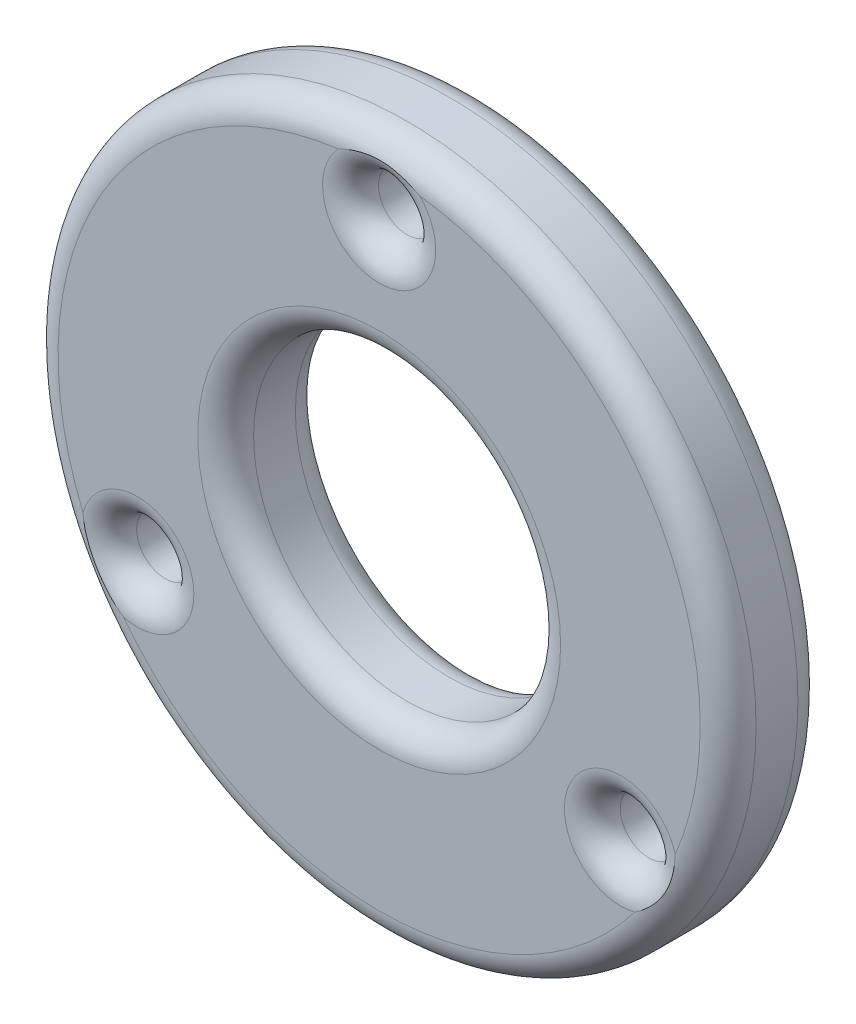
ISO-10303-21;
HEADER;
FILE_DESCRIPTION(('STEP AP214'),'2;1');
FILE_NAME('part.step','',(''),(''),'','','');
FILE_SCHEMA(('AUTOMOTIVE_DESIGN { 1 0 10303 214 1 1 1 1 }'));
ENDSEC;
DATA;
#1=APPLICATION_CONTEXT('core data for automotive mechanical design processes');
#2=APPLICATION_PROTOCOL_DEFINITION('international standard','automotive_design',2000,#1);
#3=PRODUCT_CONTEXT('',#1,'mechanical');
#4=PRODUCT('Part','Part','',(#3));
#5=PRODUCT_RELATED_PRODUCT_CATEGORY('part','',(#4));
#6=PRODUCT_DEFINITION_FORMATION('','',#4);
#7=PRODUCT_DEFINITION_CONTEXT('part definition',#1,'design');
#8=PRODUCT_DEFINITION('design','',#6,#7);
#9=PRODUCT_DEFINITION_SHAPE('','',#8);
#10=(LENGTH_UNIT() NAMED_UNIT(*) SI_UNIT(.MILLI.,.METRE.));
#11=(NAMED_UNIT(*) PLANE_ANGLE_UNIT() SI_UNIT($,.RADIAN.));
#12=(NAMED_UNIT(*) SI_UNIT($,.STERADIAN.) SOLID_ANGLE_UNIT());
#13=UNCERTAINTY_MEASURE_WITH_UNIT(LENGTH_MEASURE(1.E-05),#10,'distance_accuracy_value','');
#14=(GEOMETRIC_REPRESENTATION_CONTEXT(3) GLOBAL_UNCERTAINTY_ASSIGNED_CONTEXT((#13)) GLOBAL_UNIT_ASSIGNED_CONTEXT((#10,
#11,#12)) REPRESENTATION_CONTEXT('',''));
#15=CARTESIAN_POINT('',(0.,0.,0.));
#16=DIRECTION('',(0.,0.,1.));
#17=DIRECTION('',(1.,0.,0.));
#18=AXIS2_PLACEMENT_3D('',#15,#16,#17);
#19=CARTESIAN_POINT('',(0.,110.,3.5));
#20=DIRECTION('',(0.,0.,-1.));
#21=DIRECTION('',(-1.,0.,0.));
#22=AXIS2_PLACEMENT_3D('',#19,#20,#21);
#23=CYLINDRICAL_SURFACE('',#22,2.05);
#24=CARTESIAN_POINT('',(0.,110.,1.5));
#25=DIRECTION('',(0.,0.,1.));
#26=DIRECTION('',(1.,0.,0.));
#27=AXIS2_PLACEMENT_3D('',#24,#25,#26);
#28=CIRCLE('',#27,2.05);
#29=CARTESIAN_POINT('',(2.05,110.,1.5));
#30=VERTEX_POINT('',#29);
#31=EDGE_CURVE('E154',#30,#30,#28,.T.);
#32=ORIENTED_EDGE('',*,*,#31,.T.);
#33=EDGE_LOOP('',(#32));
#34=FACE_BOUND('',#33,.T.);
#35=CARTESIAN_POINT('',(0.,110.,-1.5));
#36=DIRECTION('',(0.,0.,1.));
#37=DIRECTION('',(1.,0.,0.));
#38=AXIS2_PLACEMENT_3D('',#35,#36,#37);
#39=CIRCLE('',#38,2.05);
#40=CARTESIAN_POINT('',(2.05,110.,-1.5));
#41=VERTEX_POINT('',#40);
#42=EDGE_CURVE('E151',#41,#41,#39,.F.);
#43=ORIENTED_EDGE('',*,*,#42,.T.);
#44=EDGE_LOOP('',(#43));
#45=FACE_BOUND('',#44,.T.);
#46=ADVANCED_FACE('F39',(#34,#45),#23,.F.);
#47=CARTESIAN_POINT('',(17.3205080756888,80.,3.5));
#48=DIRECTION('',(0.,0.,-1.));
#49=DIRECTION('',(-1.,0.,0.));
#50=AXIS2_PLACEMENT_3D('',#47,#48,#49);
#51=CYLINDRICAL_SURFACE('',#50,2.04999999999999);
#52=CARTESIAN_POINT('',(17.3205080756888,80.,1.5));
#53=DIRECTION('',(0.,0.,1.));
#54=DIRECTION('',(1.,0.,0.));
#55=AXIS2_PLACEMENT_3D('',#52,#53,#54);
#56=CIRCLE('',#55,2.04999999999999);
#57=CARTESIAN_POINT('',(19.3705080756888,80.,1.5));
#58=VERTEX_POINT('',#57);
#59=EDGE_CURVE('E160',#58,#58,#56,.T.);
#60=ORIENTED_EDGE('',*,*,#59,.T.);
#61=EDGE_LOOP('',(#60));
#62=FACE_BOUND('',#61,.T.);
#63=CARTESIAN_POINT('',(17.3205080756888,80.,-1.5));
#64=DIRECTION('',(0.,0.,1.));
#65=DIRECTION('',(1.,0.,0.));
#66=AXIS2_PLACEMENT_3D('',#63,#64,#65);
#67=CIRCLE('',#66,2.04999999999999);
#68=CARTESIAN_POINT('',(19.3705080756888,80.,-1.5));
#69=VERTEX_POINT('',#68);
#70=EDGE_CURVE('E157',#69,#69,#67,.F.);
#71=ORIENTED_EDGE('',*,*,#70,.T.);
#72=EDGE_LOOP('',(#71));
#73=FACE_BOUND('',#72,.T.);
#74=ADVANCED_FACE('F270',(#62,#73),#51,.F.);
#75=CARTESIAN_POINT('',(-17.3205080756888,80.,3.5));
#76=DIRECTION('',(0.,0.,-1.));
#77=DIRECTION('',(-1.,0.,0.));
#78=AXIS2_PLACEMENT_3D('',#75,#76,#77);
#79=CYLINDRICAL_SURFACE('',#78,2.04999999999998);
#80=CARTESIAN_POINT('',(-17.3205080756888,80.,1.5));
#81=DIRECTION('',(0.,0.,1.));
#82=DIRECTION('',(1.,0.,0.));
#83=AXIS2_PLACEMENT_3D('',#80,#81,#82);
#84=CIRCLE('',#83,2.04999999999998);
#85=CARTESIAN_POINT('',(-15.2705080756888,80.,1.5));
#86=VERTEX_POINT('',#85);
#87=EDGE_CURVE('E166',#86,#86,#84,.T.);
#88=ORIENTED_EDGE('',*,*,#87,.T.);
#89=EDGE_LOOP('',(#88));
#90=FACE_BOUND('',#89,.T.);
#91=CARTESIAN_POINT('',(-17.3205080756888,80.,-1.5));
#92=DIRECTION('',(0.,0.,1.));
#93=DIRECTION('',(1.,0.,0.));
#94=AXIS2_PLACEMENT_3D('',#91,#92,#93);
#95=CIRCLE('',#94,2.04999999999998);
#96=CARTESIAN_POINT('',(-15.2705080756888,80.,-1.5));
#97=VERTEX_POINT('',#96);
#98=EDGE_CURVE('E163',#97,#97,#95,.F.);
#99=ORIENTED_EDGE('',*,*,#98,.T.);
#100=EDGE_LOOP('',(#99));
#101=FACE_BOUND('',#100,.T.);
#102=ADVANCED_FACE('F276',(#90,#101),#79,.F.);
#103=CARTESIAN_POINT('',(0.,90.,3.5));
#104=DIRECTION('',(0.,0.,-1.));
#105=DIRECTION('',(-1.,0.,0.));
#106=AXIS2_PLACEMENT_3D('',#103,#104,#105);
#107=CYLINDRICAL_SURFACE('',#106,11.);
#108=CARTESIAN_POINT('',(0.,90.,1.5));
#109=DIRECTION('',(0.,0.,1.));
#110=DIRECTION('',(1.,0.,0.));
#111=AXIS2_PLACEMENT_3D('',#108,#109,#110);
#112=CIRCLE('',#111,11.);
#113=CARTESIAN_POINT('',(11.,90.,1.5));
#114=VERTEX_POINT('',#113);
#115=EDGE_CURVE('E172',#114,#114,#112,.T.);
#116=ORIENTED_EDGE('',*,*,#115,.T.);
#117=EDGE_LOOP('',(#116));
#118=FACE_BOUND('',#117,.T.);
#119=CARTESIAN_POINT('',(0.,90.,-1.5));
#120=DIRECTION('',(0.,0.,1.));
#121=DIRECTION('',(1.,0.,0.));
#122=AXIS2_PLACEMENT_3D('',#119,#120,#121);
#123=CIRCLE('',#122,11.);
#124=CARTESIAN_POINT('',(11.,90.,-1.5));
#125=VERTEX_POINT('',#124);
#126=EDGE_CURVE('E169',#125,#125,#123,.F.);
#127=ORIENTED_EDGE('',*,*,#126,.T.);
#128=EDGE_LOOP('',(#127));
#129=FACE_BOUND('',#128,.T.);
#130=ADVANCED_FACE('F285',(#118,#129),#107,.F.);
#131=CARTESIAN_POINT('',(0.,90.,3.5));
#132=DIRECTION('',(0.,0.,-1.));
#133=DIRECTION('',(-1.,0.,0.));
#134=AXIS2_PLACEMENT_3D('',#131,#132,#133);
#135=CYLINDRICAL_SURFACE('',#134,25.);
#136=CARTESIAN_POINT('',(0.,90.,1.5));
#137=DIRECTION('',(0.,0.,1.));
#138=DIRECTION('',(1.,0.,0.));
#139=AXIS2_PLACEMENT_3D('',#136,#137,#138);
#140=CIRCLE('',#139,25.);
#141=CARTESIAN_POINT('',(25.,90.,1.5));
#142=VERTEX_POINT('',#141);
#143=EDGE_CURVE('E148',#142,#142,#140,.F.);
#144=ORIENTED_EDGE('',*,*,#143,.T.);
#145=EDGE_LOOP('',(#144));
#146=FACE_BOUND('',#145,.T.);
#147=CARTESIAN_POINT('',(0.,90.,-1.5));
#148=DIRECTION('',(0.,0.,1.));
#149=DIRECTION('',(1.,0.,0.));
#150=AXIS2_PLACEMENT_3D('',#147,#148,#149);
#151=CIRCLE('',#150,25.);
#152=CARTESIAN_POINT('',(25.,90.,-1.5));
#153=VERTEX_POINT('',#152);
#154=EDGE_CURVE('E145',#153,#153,#151,.T.);
#155=ORIENTED_EDGE('',*,*,#154,.T.);
#156=EDGE_LOOP('',(#155));
#157=FACE_BOUND('',#156,.T.);
#158=ADVANCED_FACE('F281',(#146,#157),#135,.T.);
#159=CARTESIAN_POINT('',(0.,0.,3.5));
#160=DIRECTION('',(0.,0.,1.));
#161=DIRECTION('',(1.,0.,0.));
#162=AXIS2_PLACEMENT_3D('',#159,#160,#161);
#163=PLANE('',#162);
#164=CARTESIAN_POINT('',(17.3205080756888,80.,3.5));
#165=DIRECTION('',(0.,0.,1.));
#166=DIRECTION('',(1.,0.,0.));
#167=AXIS2_PLACEMENT_3D('',#164,#165,#166);
#168=CIRCLE('',#167,4.04999999999999);
#169=CARTESIAN_POINT('',(18.3024113712712,76.0708313960681,3.5));
#170=VERTEX_POINT('',#169);
#171=CARTESIAN_POINT('',(21.2142195502373,81.1142311039319,3.5));
#172=VERTEX_POINT('',#171);
#173=EDGE_CURVE('E135',#170,#172,#168,.F.);
#174=ORIENTED_EDGE('',*,*,#173,.T.);
#175=CARTESIAN_POINT('',(0.,90.,3.5));
#176=DIRECTION('',(0.,0.,1.));
#177=DIRECTION('',(1.,0.,0.));
#178=AXIS2_PLACEMENT_3D('',#175,#176,#177);
#179=CIRCLE('',#178,23.);
#180=CARTESIAN_POINT('',(23.,90.,3.5));
#181=VERTEX_POINT('',#180);
#182=EDGE_CURVE('E143',#172,#181,#179,.T.);
#183=ORIENTED_EDGE('',*,*,#182,.T.);
#184=CARTESIAN_POINT('',(0.,90.,3.5));
#185=DIRECTION('',(0.,0.,1.));
#186=DIRECTION('',(1.,0.,0.));
#187=AXIS2_PLACEMENT_3D('',#184,#185,#186);
#188=CIRCLE('',#187,23.);
#189=CARTESIAN_POINT('',(2.91180817896607,112.8149375,3.5));
#190=VERTEX_POINT('',#189);
#191=EDGE_CURVE('E141',#181,#190,#188,.T.);
#192=ORIENTED_EDGE('',*,*,#191,.T.);
#193=CARTESIAN_POINT('',(0.,110.,3.5));
#194=DIRECTION('',(0.,0.,1.));
#195=DIRECTION('',(1.,0.,0.));
#196=AXIS2_PLACEMENT_3D('',#193,#194,#195);
#197=CIRCLE('',#196,4.05);
#198=CARTESIAN_POINT('',(4.05,110.,3.5));
#199=VERTEX_POINT('',#198);
#200=EDGE_CURVE('E139',#190,#199,#197,.F.);
#201=ORIENTED_EDGE('',*,*,#200,.T.);
#202=CARTESIAN_POINT('',(0.,110.,3.5));
#203=DIRECTION('',(0.,0.,1.));
#204=DIRECTION('',(1.,0.,0.));
#205=AXIS2_PLACEMENT_3D('',#202,#203,#204);
#206=CIRCLE('',#205,4.05);
#207=CARTESIAN_POINT('',(-2.91180817896607,112.8149375,3.5));
#208=VERTEX_POINT('',#207);
#209=EDGE_CURVE('E137',#199,#208,#206,.F.);
#210=ORIENTED_EDGE('',*,*,#209,.T.);
#211=CARTESIAN_POINT('',(0.,90.,3.5));
#212=DIRECTION('',(0.,0.,1.));
#213=DIRECTION('',(1.,0.,0.));
#214=AXIS2_PLACEMENT_3D('',#211,#212,#213);
#215=CIRCLE('',#214,23.);
#216=CARTESIAN_POINT('',(-21.2142195502372,81.1142311039319,3.5));
#217=VERTEX_POINT('',#216);
#218=EDGE_CURVE('E120',#208,#217,#215,.T.);
#219=ORIENTED_EDGE('',*,*,#218,.T.);
#220=CARTESIAN_POINT('',(-17.3205080756888,80.,3.5));
#221=DIRECTION('',(0.,0.,1.));
#222=DIRECTION('',(1.,0.,0.));
#223=AXIS2_PLACEMENT_3D('',#220,#221,#222);
#224=CIRCLE('',#223,4.04999999999998);
#225=CARTESIAN_POINT('',(-13.2705080756888,80.,3.5));
#226=VERTEX_POINT('',#225);
#227=EDGE_CURVE('E112',#217,#226,#224,.F.);
#228=ORIENTED_EDGE('',*,*,#227,.T.);
#229=CARTESIAN_POINT('',(-17.3205080756888,80.,3.5));
#230=DIRECTION('',(0.,0.,1.));
#231=DIRECTION('',(1.,0.,0.));
#232=AXIS2_PLACEMENT_3D('',#229,#230,#231);
#233=CIRCLE('',#232,4.04999999999998);
#234=CARTESIAN_POINT('',(-18.3024113712712,76.0708313960681,3.5));
#235=VERTEX_POINT('',#234);
#236=EDGE_CURVE('E117',#226,#235,#233,.F.);
#237=ORIENTED_EDGE('',*,*,#236,.T.);
#238=CARTESIAN_POINT('',(0.,90.,3.5));
#239=DIRECTION('',(0.,0.,1.));
#240=DIRECTION('',(1.,0.,0.));
#241=AXIS2_PLACEMENT_3D('',#238,#239,#240);
#242=CIRCLE('',#241,23.);
#243=EDGE_CURVE('E133',#235,#170,#242,.T.);
#244=ORIENTED_EDGE('',*,*,#243,.T.);
#245=EDGE_LOOP('',(#174,#183,#192,#201,#210,#219,#228,#237,#244));
#246=FACE_BOUND('',#245,.T.);
#247=CARTESIAN_POINT('',(0.,90.,3.5));
#248=DIRECTION('',(0.,0.,1.));
#249=DIRECTION('',(1.,0.,0.));
#250=AXIS2_PLACEMENT_3D('',#247,#248,#249);
#251=CIRCLE('',#250,13.);
#252=CARTESIAN_POINT('',(13.,90.,3.5));
#253=VERTEX_POINT('',#252);
#254=EDGE_CURVE('E127',#253,#253,#251,.F.);
#255=ORIENTED_EDGE('',*,*,#254,.T.);
#256=EDGE_LOOP('',(#255));
#257=FACE_BOUND('',#256,.T.);
#258=ADVANCED_FACE('F114',(#246,#257),#163,.T.);
#259=CARTESIAN_POINT('',(0.,0.,-3.5));
#260=DIRECTION('',(0.,0.,1.));
#261=DIRECTION('',(1.,0.,0.));
#262=AXIS2_PLACEMENT_3D('',#259,#260,#261);
#263=PLANE('',#262);
#264=CARTESIAN_POINT('',(0.,110.,-3.5));
#265=DIRECTION('',(0.,0.,1.));
#266=DIRECTION('',(1.,0.,0.));
#267=AXIS2_PLACEMENT_3D('',#264,#265,#266);
#268=CIRCLE('',#267,4.05);
#269=CARTESIAN_POINT('',(-2.91180817896607,112.8149375,-3.5));
#270=VERTEX_POINT('',#269);
#271=CARTESIAN_POINT('',(4.05,110.,-3.5));
#272=VERTEX_POINT('',#271);
#273=EDGE_CURVE('E189',#270,#272,#268,.T.);
#274=ORIENTED_EDGE('',*,*,#273,.T.);
#275=CARTESIAN_POINT('',(0.,110.,-3.5));
#276=DIRECTION('',(0.,0.,1.));
#277=DIRECTION('',(1.,0.,0.));
#278=AXIS2_PLACEMENT_3D('',#275,#276,#277);
#279=CIRCLE('',#278,4.05);
#280=CARTESIAN_POINT('',(2.91180817896607,112.8149375,-3.5));
#281=VERTEX_POINT('',#280);
#282=EDGE_CURVE('E11',#272,#281,#279,.T.);
#283=ORIENTED_EDGE('',*,*,#282,.T.);
#284=CARTESIAN_POINT('',(0.,90.,-3.5));
#285=DIRECTION('',(0.,0.,1.));
#286=DIRECTION('',(1.,0.,0.));
#287=AXIS2_PLACEMENT_3D('',#284,#285,#286);
#288=CIRCLE('',#287,23.);
#289=CARTESIAN_POINT('',(23.,90.,-3.5));
#290=VERTEX_POINT('',#289);
#291=EDGE_CURVE('E53',#281,#290,#288,.F.);
#292=ORIENTED_EDGE('',*,*,#291,.T.);
#293=CARTESIAN_POINT('',(0.,90.,-3.5));
#294=DIRECTION('',(0.,0.,1.));
#295=DIRECTION('',(1.,0.,0.));
#296=AXIS2_PLACEMENT_3D('',#293,#294,#295);
#297=CIRCLE('',#296,23.);
#298=CARTESIAN_POINT('',(21.2142195502373,81.1142311039319,-3.5));
#299=VERTEX_POINT('',#298);
#300=EDGE_CURVE('E191',#290,#299,#297,.F.);
#301=ORIENTED_EDGE('',*,*,#300,.T.);
#302=CARTESIAN_POINT('',(17.3205080756888,80.,-3.5));
#303=DIRECTION('',(0.,0.,1.));
#304=DIRECTION('',(1.,0.,0.));
#305=AXIS2_PLACEMENT_3D('',#302,#303,#304);
#306=CIRCLE('',#305,4.04999999999999);
#307=CARTESIAN_POINT('',(18.3024113712712,76.0708313960681,-3.5));
#308=VERTEX_POINT('',#307);
#309=EDGE_CURVE('E187',#299,#308,#306,.T.);
#310=ORIENTED_EDGE('',*,*,#309,.T.);
#311=CARTESIAN_POINT('',(0.,90.,-3.5));
#312=DIRECTION('',(0.,0.,1.));
#313=DIRECTION('',(1.,0.,0.));
#314=AXIS2_PLACEMENT_3D('',#311,#312,#313);
#315=CIRCLE('',#314,23.);
#316=CARTESIAN_POINT('',(-18.3024113712712,76.0708313960681,-3.5));
#317=VERTEX_POINT('',#316);
#318=EDGE_CURVE('E182',#308,#317,#315,.F.);
#319=ORIENTED_EDGE('',*,*,#318,.T.);
#320=CARTESIAN_POINT('',(-17.3205080756888,80.,-3.5));
#321=DIRECTION('',(0.,0.,1.));
#322=DIRECTION('',(1.,0.,0.));
#323=AXIS2_PLACEMENT_3D('',#320,#321,#322);
#324=CIRCLE('',#323,4.04999999999998);
#325=CARTESIAN_POINT('',(-13.2705080756888,80.,-3.5));
#326=VERTEX_POINT('',#325);
#327=EDGE_CURVE('E180',#317,#326,#324,.T.);
#328=ORIENTED_EDGE('',*,*,#327,.T.);
#329=CARTESIAN_POINT('',(-17.3205080756888,80.,-3.5));
#330=DIRECTION('',(0.,0.,1.));
#331=DIRECTION('',(1.,0.,0.));
#332=AXIS2_PLACEMENT_3D('',#329,#330,#331);
#333=CIRCLE('',#332,4.04999999999998);
#334=CARTESIAN_POINT('',(-21.2142195502372,81.1142311039319,-3.5));
#335=VERTEX_POINT('',#334);
#336=EDGE_CURVE('E178',#326,#335,#333,.T.);
#337=ORIENTED_EDGE('',*,*,#336,.T.);
#338=CARTESIAN_POINT('',(0.,90.,-3.5));
#339=DIRECTION('',(0.,0.,1.));
#340=DIRECTION('',(1.,0.,0.));
#341=AXIS2_PLACEMENT_3D('',#338,#339,#340);
#342=CIRCLE('',#341,23.);
#343=EDGE_CURVE('E184',#335,#270,#342,.F.);
#344=ORIENTED_EDGE('',*,*,#343,.T.);
#345=EDGE_LOOP('',(#274,#283,#292,#301,#310,#319,#328,#337,#344));
#346=FACE_BOUND('',#345,.T.);
#347=CARTESIAN_POINT('',(0.,90.,-3.5));
#348=DIRECTION('',(0.,0.,1.));
#349=DIRECTION('',(1.,0.,0.));
#350=AXIS2_PLACEMENT_3D('',#347,#348,#349);
#351=CIRCLE('',#350,13.);
#352=CARTESIAN_POINT('',(13.,90.,-3.5));
#353=VERTEX_POINT('',#352);
#354=EDGE_CURVE('E175',#353,#353,#351,.T.);
#355=ORIENTED_EDGE('',*,*,#354,.T.);
#356=EDGE_LOOP('',(#355));
#357=FACE_BOUND('',#356,.T.);
#358=ADVANCED_FACE('F299',(#346,#357),#263,.F.);
#359=CARTESIAN_POINT('',(-17.3205080756888,80.,1.5));
#360=DIRECTION('',(0.,0.,1.));
#361=DIRECTION('',(1.,0.,0.));
#362=AXIS2_PLACEMENT_3D('',#359,#360,#361);
#363=TOROIDAL_SURFACE('',#362,4.04999999999998,2.);
#364=ORIENTED_EDGE('',*,*,#87,.F.);
#365=EDGE_LOOP('',(#364));
#366=FACE_BOUND('',#365,.T.);
#367=ORIENTED_EDGE('',*,*,#236,.F.);
#368=ORIENTED_EDGE('',*,*,#227,.F.);
#369=CARTESIAN_POINT('',(-18.3024113712712,76.0708313960681,3.5));
#370=CARTESIAN_POINT('',(-18.3055600508459,76.07290589684,3.49999999778702));
#371=CARTESIAN_POINT('',(-18.3087071483363,76.0749828587634,3.49999882745515));
#372=CARTESIAN_POINT('',(-18.4528160739977,76.1702499008669,3.4998921740828));
#373=CARTESIAN_POINT('',(-18.5905885847528,76.2683785894792,3.49746298069368));
#374=CARTESIAN_POINT('',(-18.8585738433322,76.4743973095386,3.48984296482323));
#375=CARTESIAN_POINT('',(-18.9887843260777,76.5822902411957,3.4846513195796));
#376=CARTESIAN_POINT('',(-19.2408642337091,76.8078984539134,3.47324551640929));
#377=CARTESIAN_POINT('',(-19.3627158869221,76.9256335497465,3.46702927001829));
#378=CARTESIAN_POINT('',(-19.596738008294,77.1703678884771,3.45514359415114));
#379=CARTESIAN_POINT('',(-19.708909591914,77.2973660608441,3.44947410166216));
#380=CARTESIAN_POINT('',(-19.933906847776,77.5739792331601,3.43943777226803));
#381=CARTESIAN_POINT('',(-20.0455516067505,77.7245665283705,3.43527162275805));
#382=CARTESIAN_POINT('',(-20.2546671890964,78.0353623046309,3.43021588767944));
#383=CARTESIAN_POINT('',(-20.3521364276915,78.1955718585928,3.4293266681907));
#384=CARTESIAN_POINT('',(-20.531964566209,78.5241977574197,3.43104712309598));
#385=CARTESIAN_POINT('',(-20.6143262179609,78.6926126006133,3.4336561595658));
#386=CARTESIAN_POINT('',(-20.7634117078092,79.0361226033606,3.44171505116951));
#387=CARTESIAN_POINT('',(-20.8301379617759,79.2112167260117,3.4471644670081));
#388=CARTESIAN_POINT('',(-20.9348465197601,79.5273814844724,3.45811948661555));
#389=CARTESIAN_POINT('',(-20.9759227050644,79.6674467845882,3.46334806823336));
#390=CARTESIAN_POINT('',(-21.0485870102707,79.9500254347904,3.47374614122179));
#391=CARTESIAN_POINT('',(-21.0801721950621,80.0925395277959,3.47891561383838));
#392=CARTESIAN_POINT('',(-21.1607902395262,80.5222200933492,3.4927632698755));
#393=CARTESIAN_POINT('',(-21.1959294631246,80.8122722778809,3.49981710937759));
#394=CARTESIAN_POINT('',(-21.2137721800964,81.1067031127014,3.49999882242134));
#395=CARTESIAN_POINT('',(-21.2139973332755,81.1104670602895,3.49999999265972));
#396=CARTESIAN_POINT('',(-21.2142195502372,81.1142311039319,3.50000000000006));
#397=B_SPLINE_CURVE_WITH_KNOTS('',3,(#369,#370,#371,#372,#373,#374,#375,#376,#377,#378,#379,
#380,#381,#382,#383,#384,#385,#386,#387,#388,#389,#390,#391,#392,#393,#394,#395,#396),
.UNSPECIFIED.,.F.,.F.,(4,2,2,2,2,2,2,2,2,2,2,2,2,4),(0.,0.0113120208192489,0.518251053757005,
1.02534115683348,1.5334779521618,2.04155611507177,2.60326790459218,3.16504244344029,
3.72671455386544,4.28829982140542,4.72612845686464,5.16409235267221,6.03767547928823,
6.04898750010813),.UNSPECIFIED.);
#398=EDGE_CURVE('E125',#235,#217,#397,.T.);
#399=ORIENTED_EDGE('',*,*,#398,.F.);
#400=EDGE_LOOP('',(#367,#368,#399));
#401=FACE_BOUND('',#400,.T.);
#402=ADVANCED_FACE('F124',(#366,#401),#363,.T.);
#403=CARTESIAN_POINT('',(17.3205080756888,80.,1.5));
#404=DIRECTION('',(0.,0.,1.));
#405=DIRECTION('',(1.,0.,0.));
#406=AXIS2_PLACEMENT_3D('',#403,#404,#405);
#407=TOROIDAL_SURFACE('',#406,4.04999999999999,2.);
#408=ORIENTED_EDGE('',*,*,#59,.F.);
#409=EDGE_LOOP('',(#408));
#410=FACE_BOUND('',#409,.T.);
#411=CARTESIAN_POINT('',(21.2142195502373,81.1142311039319,3.50000000000006));
#412=CARTESIAN_POINT('',(21.213997319656,81.1104670170459,3.49999999778706));
#413=CARTESIAN_POINT('',(21.2137721666128,81.1067030697093,3.49999882745517));
#414=CARTESIAN_POINT('',(21.2033229508384,80.9342675581226,3.49989217408202));
#415=CARTESIAN_POINT('',(21.1872272690376,80.7658887195594,3.49746298069347));
#416=CARTESIAN_POINT('',(21.1428024531008,80.4307973177602,3.48984296482344));
#417=CARTESIAN_POINT('',(21.1144696747697,80.264085266035,3.48465131957965));
#418=CARTESIAN_POINT('',(21.0451271850695,79.9329735558836,3.47324551640923));
#419=CARTESIAN_POINT('',(21.0040914277675,79.7685793807914,3.46702927001827));
#420=CARTESIAN_POINT('',(20.9091563339343,79.4435431092706,3.45514359415115));
#421=CARTESIAN_POINT('',(20.8552584822403,79.2829005820894,3.44947410166216));
#422=CARTESIAN_POINT('',(20.7282030759243,78.9497406565735,3.43943777226803));
#423=CARTESIAN_POINT('',(20.6536130322724,78.7777598114974,3.43527162275806));
#424=CARTESIAN_POINT('',(20.4890137858154,78.4412625167292,3.43021588767945));
#425=CARTESIAN_POINT('',(20.3990028614532,78.2767469030376,3.4293266681907));
#426=CARTESIAN_POINT('',(20.2043185539869,77.9566982173536,3.43104712309595));
#427=CARTESIAN_POINT('',(20.0996478472833,77.8011635130423,3.43365615956575));
#428=CARTESIAN_POINT('',(19.8767022033749,77.5002966901249,3.4417150511694));
#429=CARTESIAN_POINT('',(19.7584293720894,77.3549629977651,3.44716446700796));
#430=CARTESIAN_POINT('',(19.5369769384733,77.1062003473266,3.45811948661539));
#431=CARTESIAN_POINT('',(19.4362149230363,77.0005946773043,3.46334806823319));
#432=CARTESIAN_POINT('',(19.2278267859968,76.7963762179455,3.47374614122168));
#433=CARTESIAN_POINT('',(19.1201985534522,76.6977655990298,3.47891561383832));
#434=CARTESIAN_POINT('',(18.7883932904017,76.413108041743,3.49276326987537));
#435=CARTESIAN_POINT('',(18.5547703419723,76.2376504891716,3.49981710937711));
#436=CARTESIAN_POINT('',(18.3087071178458,76.0749828255902,3.49999882242135));
#437=CARTESIAN_POINT('',(18.3055600202056,76.0729058634233,3.49999999265974));
#438=CARTESIAN_POINT('',(18.3024113712712,76.0708313960681,3.50000000000007));
#439=B_SPLINE_CURVE_WITH_KNOTS('',3,(#411,#412,#413,#414,#415,#416,#417,#418,#419,#420,#421,
#422,#423,#424,#425,#426,#427,#428,#429,#430,#431,#432,#433,#434,#435,#436,#437,#438),
.UNSPECIFIED.,.F.,.F.,(4,2,2,2,2,2,2,2,2,2,2,2,2,4),(0.,0.011312020819252,0.518251053757112,
1.02534115683364,1.53347795216199,2.041556115072,2.60326790459117,3.16504244343799,
3.72671455386177,4.28829982140041,4.72612845686088,5.16409235266963,6.03767547928826,
6.04898750010815),.UNSPECIFIED.);
#440=EDGE_CURVE('E202',#172,#170,#439,.T.);
#441=ORIENTED_EDGE('',*,*,#440,.F.);
#442=ORIENTED_EDGE('',*,*,#173,.F.);
#443=EDGE_LOOP('',(#441,#442));
#444=FACE_BOUND('',#443,.T.);
#445=ADVANCED_FACE('F215',(#410,#444),#407,.T.);
#446=CARTESIAN_POINT('',(0.,110.,1.5));
#447=DIRECTION('',(0.,0.,1.));
#448=DIRECTION('',(1.,0.,0.));
#449=AXIS2_PLACEMENT_3D('',#446,#447,#448);
#450=TOROIDAL_SURFACE('',#449,4.05,2.);
#451=ORIENTED_EDGE('',*,*,#31,.F.);
#452=EDGE_LOOP('',(#451));
#453=FACE_BOUND('',#452,.T.);
#454=ORIENTED_EDGE('',*,*,#209,.F.);
#455=ORIENTED_EDGE('',*,*,#200,.F.);
#456=CARTESIAN_POINT('',(-2.91180817896608,112.8149375,3.5));
#457=CARTESIAN_POINT('',(-2.90843726881009,112.816627086114,3.49999999778702));
#458=CARTESIAN_POINT('',(-2.90506501827654,112.818314071527,3.49999882745515));
#459=CARTESIAN_POINT('',(-2.750506876842,112.895482541012,3.49989217408282));
#460=CARTESIAN_POINT('',(-2.59663868428592,112.965732690961,3.4974629806937));
#461=CARTESIAN_POINT('',(-2.28422860976995,113.0948053727,3.48984296482327));
#462=CARTESIAN_POINT('',(-2.12568534869389,113.153624492768,3.48465131957966));
#463=CARTESIAN_POINT('',(-1.80426295136288,113.259127990202,3.47324551640938));
#464=CARTESIAN_POINT('',(-1.64137554084798,113.305787069461,3.46702927001838));
#465=CARTESIAN_POINT('',(-1.31241832564342,113.386089002251,3.45514359415125));
#466=CARTESIAN_POINT('',(-1.14634889032963,113.419733357066,3.44947410166226));
#467=CARTESIAN_POINT('',(-0.794296228144641,113.476280110267,3.43943777226791));
#468=CARTESIAN_POINT('',(-0.608061425510671,113.497673660134,3.43527162275779));
#469=CARTESIAN_POINT('',(-0.234346596692621,113.523375178642,3.43021588767919));
#470=CARTESIAN_POINT('',(-0.0468664337275866,113.527681238372,3.4293266681906));
#471=CARTESIAN_POINT('',(0.327646012271175,113.519104025227,3.43104712309644));
#472=CARTESIAN_POINT('',(0.514678370734265,113.506223886343,3.43365615956667));
#473=CARTESIAN_POINT('',(0.886709504505495,113.463580706508,3.4417150511713));
#474=CARTESIAN_POINT('',(1.07170858976477,113.433820276214,3.44716446701039));
#475=CARTESIAN_POINT('',(1.39786958136456,113.366418168187,3.45811948661824));
#476=CARTESIAN_POINT('',(1.53970778209849,113.331958538093,3.46334806823588));
#477=CARTESIAN_POINT('',(1.82076022432968,113.25359834725,3.47374614122373));
#478=CARTESIAN_POINT('',(1.95997364165843,113.209694873161,3.4789156138399));
#479=CARTESIAN_POINT('',(2.37239694915161,113.064671864898,3.49276326987642));
#480=CARTESIAN_POINT('',(2.64115912116535,112.950077232943,3.49981710937899));
#481=CARTESIAN_POINT('',(2.90506506225059,112.818314061708,3.49999882242133));
#482=CARTESIAN_POINT('',(2.90843731306999,112.816627076287,3.49999999265969));
#483=CARTESIAN_POINT('',(2.91180817896608,112.8149375,3.5));
#484=B_SPLINE_CURVE_WITH_KNOTS('',3,(#456,#457,#458,#459,#460,#461,#462,#463,#464,#465,#466,
#467,#468,#469,#470,#471,#472,#473,#474,#475,#476,#477,#478,#479,#480,#481,#482,#483),
.UNSPECIFIED.,.F.,.F.,(4,2,2,2,2,2,2,2,2,2,2,2,2,4),(0.,0.0113120208192557,0.518251053755737,
1.02534115683118,1.53347795215899,2.04155611506824,2.60326790461059,3.16504244348078,
3.72671455392752,4.288299821489,4.72612845692734,5.164092352714,6.03767547928836,
6.04898750010823),.UNSPECIFIED.);
#485=EDGE_CURVE('E194',#208,#190,#484,.T.);
#486=ORIENTED_EDGE('',*,*,#485,.F.);
#487=EDGE_LOOP('',(#454,#455,#486));
#488=FACE_BOUND('',#487,.T.);
#489=ADVANCED_FACE('F211',(#453,#488),#450,.T.);
#490=CARTESIAN_POINT('',(0.,90.,1.5));
#491=DIRECTION('',(0.,0.,1.));
#492=DIRECTION('',(1.,0.,0.));
#493=AXIS2_PLACEMENT_3D('',#490,#491,#492);
#494=TOROIDAL_SURFACE('',#493,23.,2.);
#495=ORIENTED_EDGE('',*,*,#143,.F.);
#496=EDGE_LOOP('',(#495));
#497=FACE_BOUND('',#496,.T.);
#498=ORIENTED_EDGE('',*,*,#243,.F.);
#499=ORIENTED_EDGE('',*,*,#398,.T.);
#500=ORIENTED_EDGE('',*,*,#218,.F.);
#501=ORIENTED_EDGE('',*,*,#485,.T.);
#502=ORIENTED_EDGE('',*,*,#191,.F.);
#503=ORIENTED_EDGE('',*,*,#182,.F.);
#504=ORIENTED_EDGE('',*,*,#440,.T.);
#505=EDGE_LOOP('',(#498,#499,#500,#501,#502,#503,#504));
#506=FACE_BOUND('',#505,.T.);
#507=ADVANCED_FACE('F214',(#497,#506),#494,.T.);
#508=CARTESIAN_POINT('',(0.,90.,1.5));
#509=DIRECTION('',(0.,0.,1.));
#510=DIRECTION('',(1.,0.,0.));
#511=AXIS2_PLACEMENT_3D('',#508,#509,#510);
#512=TOROIDAL_SURFACE('',#511,13.,2.);
#513=ORIENTED_EDGE('',*,*,#254,.F.);
#514=EDGE_LOOP('',(#513));
#515=FACE_BOUND('',#514,.T.);
#516=ORIENTED_EDGE('',*,*,#115,.F.);
#517=EDGE_LOOP('',(#516));
#518=FACE_BOUND('',#517,.T.);
#519=ADVANCED_FACE('F259',(#515,#518),#512,.T.);
#520=CARTESIAN_POINT('',(-17.3205080756888,80.,-1.5));
#521=DIRECTION('',(0.,0.,1.));
#522=DIRECTION('',(1.,0.,0.));
#523=AXIS2_PLACEMENT_3D('',#520,#521,#522);
#524=TOROIDAL_SURFACE('',#523,4.04999999999998,2.);
#525=ORIENTED_EDGE('',*,*,#98,.F.);
#526=EDGE_LOOP('',(#525));
#527=FACE_BOUND('',#526,.T.);
#528=ORIENTED_EDGE('',*,*,#336,.F.);
#529=ORIENTED_EDGE('',*,*,#327,.F.);
#530=CARTESIAN_POINT('',(-21.2142195502372,81.1142311039319,-3.50000000000006));
#531=CARTESIAN_POINT('',(-21.213997319656,81.1104670170458,-3.49999999778706));
#532=CARTESIAN_POINT('',(-21.2137721666128,81.1067030697093,-3.49999882745517));
#533=CARTESIAN_POINT('',(-21.2033229508384,80.9342675581226,-3.49989217408202));
#534=CARTESIAN_POINT('',(-21.1872272690376,80.7658887195594,-3.49746298069347));
#535=CARTESIAN_POINT('',(-21.1428024531008,80.4307973177602,-3.48984296482344));
#536=CARTESIAN_POINT('',(-21.1144696747697,80.2640852660349,-3.48465131957965));
#537=CARTESIAN_POINT('',(-21.0451271850695,79.9329735558836,-3.47324551640922));
#538=CARTESIAN_POINT('',(-21.0040914277675,79.7685793807914,-3.46702927001827));
#539=CARTESIAN_POINT('',(-20.9091563339343,79.4435431092706,-3.45514359415115));
#540=CARTESIAN_POINT('',(-20.8552584822403,79.2829005820894,-3.44947410166216));
#541=CARTESIAN_POINT('',(-20.7282030759243,78.9497406565735,-3.43943777226803));
#542=CARTESIAN_POINT('',(-20.6536130322723,78.7777598114973,-3.43527162275806));
#543=CARTESIAN_POINT('',(-20.4890137858153,78.441262516729,-3.43021588767945));
#544=CARTESIAN_POINT('',(-20.399002861453,78.2767469030374,-3.4293266681907));
#545=CARTESIAN_POINT('',(-20.2043185539867,77.9566982173531,-3.43104712309596));
#546=CARTESIAN_POINT('',(-20.0996478472829,77.8011635130417,-3.43365615956576));
#547=CARTESIAN_POINT('',(-19.8767022033743,77.5002966901242,-3.44171505116942));
#548=CARTESIAN_POINT('',(-19.7584293720887,77.3549629977644,-3.44716446700798));
#549=CARTESIAN_POINT('',(-19.5369769384726,77.1062003473259,-3.45811948661544));
#550=CARTESIAN_POINT('',(-19.4362149230357,77.0005946773036,-3.46334806823327));
#551=CARTESIAN_POINT('',(-19.2278267859962,76.796376217945,-3.47374614122166));
#552=CARTESIAN_POINT('',(-19.1201985534516,76.6977655990294,-3.47891561383818));
#553=CARTESIAN_POINT('',(-18.7883932904014,76.4131080417425,-3.49276326987572));
#554=CARTESIAN_POINT('',(-18.5547703419727,76.2376504891705,-3.49981710937894));
#555=CARTESIAN_POINT('',(-18.3087071178459,76.0749828255902,-3.49999882242133));
#556=CARTESIAN_POINT('',(-18.3055600202056,76.0729058634233,-3.49999999265969));
#557=CARTESIAN_POINT('',(-18.3024113712712,76.0708313960681,-3.5));
#558=B_SPLINE_CURVE_WITH_KNOTS('',3,(#530,#531,#532,#533,#534,#535,#536,#537,#538,#539,#540,
#541,#542,#543,#544,#545,#546,#547,#548,#549,#550,#551,#552,#553,#554,#555,#556,#557),
.UNSPECIFIED.,.F.,.F.,(4,2,2,2,2,2,2,2,2,2,2,2,2,4),(0.,0.011312020819252,0.518251053757112,
1.02534115683367,1.53347795216199,2.04155611507196,2.60326790459129,3.16504244343834,
3.72671455386251,4.28829982140149,4.72612845686174,5.16409235267034,6.03767547928821,
6.04898750010813),.UNSPECIFIED.);
#559=EDGE_CURVE('E43',#335,#317,#558,.T.);
#560=ORIENTED_EDGE('',*,*,#559,.F.);
#561=EDGE_LOOP('',(#528,#529,#560));
#562=FACE_BOUND('',#561,.T.);
#563=ADVANCED_FACE('F254',(#527,#562),#524,.T.);
#564=CARTESIAN_POINT('',(0.,110.,-1.5));
#565=DIRECTION('',(0.,0.,1.));
#566=DIRECTION('',(1.,0.,0.));
#567=AXIS2_PLACEMENT_3D('',#564,#565,#566);
#568=TOROIDAL_SURFACE('',#567,4.05,2.);
#569=ORIENTED_EDGE('',*,*,#42,.F.);
#570=EDGE_LOOP('',(#569));
#571=FACE_BOUND('',#570,.T.);
#572=ORIENTED_EDGE('',*,*,#282,.F.);
#573=ORIENTED_EDGE('',*,*,#273,.F.);
#574=CARTESIAN_POINT('',(2.91180817896608,112.8149375,-3.5));
#575=CARTESIAN_POINT('',(2.90843726881009,112.816627086114,-3.49999999778702));
#576=CARTESIAN_POINT('',(2.90506501827654,112.818314071527,-3.49999882745515));
#577=CARTESIAN_POINT('',(2.750506876842,112.895482541012,-3.49989217408282));
#578=CARTESIAN_POINT('',(2.59663868428592,112.965732690961,-3.4974629806937));
#579=CARTESIAN_POINT('',(2.28422860976995,113.0948053727,-3.48984296482327));
#580=CARTESIAN_POINT('',(2.12568534869389,113.153624492768,-3.48465131957966));
#581=CARTESIAN_POINT('',(1.80426295136288,113.259127990202,-3.47324551640938));
#582=CARTESIAN_POINT('',(1.64137554084798,113.305787069461,-3.46702927001838));
#583=CARTESIAN_POINT('',(1.31241832564342,113.386089002251,-3.45514359415125));
#584=CARTESIAN_POINT('',(1.14634889032963,113.419733357066,-3.44947410166226));
#585=CARTESIAN_POINT('',(0.794296228144641,113.476280110267,-3.43943777226791));
#586=CARTESIAN_POINT('',(0.608061425510671,113.497673660134,-3.43527162275779));
#587=CARTESIAN_POINT('',(0.234346596692621,113.523375178642,-3.43021588767919));
#588=CARTESIAN_POINT('',(0.0468664337275866,113.527681238372,-3.4293266681906));
#589=CARTESIAN_POINT('',(-0.327646012271175,113.519104025227,-3.43104712309644));
#590=CARTESIAN_POINT('',(-0.514678370734265,113.506223886343,-3.43365615956667));
#591=CARTESIAN_POINT('',(-0.886709504505495,113.463580706508,-3.4417150511713));
#592=CARTESIAN_POINT('',(-1.07170858976477,113.433820276214,-3.44716446701039));
#593=CARTESIAN_POINT('',(-1.39786958136456,113.366418168187,-3.45811948661824));
#594=CARTESIAN_POINT('',(-1.53970778209849,113.331958538093,-3.46334806823588));
#595=CARTESIAN_POINT('',(-1.82076022432968,113.25359834725,-3.47374614122373));
#596=CARTESIAN_POINT('',(-1.95997364165843,113.209694873161,-3.4789156138399));
#597=CARTESIAN_POINT('',(-2.37239694915161,113.064671864898,-3.49276326987642));
#598=CARTESIAN_POINT('',(-2.64115912116535,112.950077232943,-3.49981710937899));
#599=CARTESIAN_POINT('',(-2.90506506225059,112.818314061708,-3.49999882242133));
#600=CARTESIAN_POINT('',(-2.90843731306999,112.816627076287,-3.49999999265969));
#601=CARTESIAN_POINT('',(-2.91180817896608,112.8149375,-3.5));
#602=B_SPLINE_CURVE_WITH_KNOTS('',3,(#574,#575,#576,#577,#578,#579,#580,#581,#582,#583,#584,
#585,#586,#587,#588,#589,#590,#591,#592,#593,#594,#595,#596,#597,#598,#599,#600,#601),
.UNSPECIFIED.,.F.,.F.,(4,2,2,2,2,2,2,2,2,2,2,2,2,4),(0.,0.0113120208192557,0.518251053755737,
1.02534115683118,1.53347795215899,2.04155611506824,2.60326790461059,3.16504244348078,
3.72671455392752,4.288299821489,4.72612845692734,5.164092352714,6.03767547928836,
6.04898750010823),.UNSPECIFIED.);
#603=EDGE_CURVE('E237',#281,#270,#602,.T.);
#604=ORIENTED_EDGE('',*,*,#603,.F.);
#605=EDGE_LOOP('',(#572,#573,#604));
#606=FACE_BOUND('',#605,.T.);
#607=ADVANCED_FACE('F249',(#571,#606),#568,.T.);
#608=CARTESIAN_POINT('',(17.3205080756888,80.,-1.5));
#609=DIRECTION('',(0.,0.,1.));
#610=DIRECTION('',(1.,0.,0.));
#611=AXIS2_PLACEMENT_3D('',#608,#609,#610);
#612=TOROIDAL_SURFACE('',#611,4.04999999999999,2.);
#613=ORIENTED_EDGE('',*,*,#70,.F.);
#614=EDGE_LOOP('',(#613));
#615=FACE_BOUND('',#614,.T.);
#616=CARTESIAN_POINT('',(18.3024113712712,76.0708313960681,-3.50000000000007));
#617=CARTESIAN_POINT('',(18.3055600508459,76.07290589684,-3.49999999778707));
#618=CARTESIAN_POINT('',(18.3087071483363,76.0749828587634,-3.49999882745517));
#619=CARTESIAN_POINT('',(18.4528160739978,76.1702499008669,-3.49989217408175));
#620=CARTESIAN_POINT('',(18.5905885847528,76.2683785894793,-3.4974629806934));
#621=CARTESIAN_POINT('',(18.8585738433322,76.4743973095386,-3.48984296482351));
#622=CARTESIAN_POINT('',(18.9887843260777,76.5822902411957,-3.48465131957967));
#623=CARTESIAN_POINT('',(19.2408642337092,76.8078984539134,-3.47324551640921));
#624=CARTESIAN_POINT('',(19.3627158869221,76.9256335497465,-3.46702927001827));
#625=CARTESIAN_POINT('',(19.5967380082939,77.1703678884771,-3.45514359415117));
#626=CARTESIAN_POINT('',(19.708909591914,77.297366060844,-3.44947410166217));
#627=CARTESIAN_POINT('',(19.933906847776,77.5739792331602,-3.43943777226802));
#628=CARTESIAN_POINT('',(20.0455516067506,77.7245665283707,-3.43527162275804));
#629=CARTESIAN_POINT('',(20.2546671890968,78.0353623046314,-3.43021588767943));
#630=CARTESIAN_POINT('',(20.352136427692,78.1955718585936,-3.42932666819069));
#631=CARTESIAN_POINT('',(20.5319645662096,78.5241977574208,-3.43104712309599));
#632=CARTESIAN_POINT('',(20.6143262179616,78.6926126006147,-3.43365615956582));
#633=CARTESIAN_POINT('',(20.76341170781,79.0361226033625,-3.44171505116956));
#634=CARTESIAN_POINT('',(20.8301379617766,79.2112167260138,-3.44716446700817));
#635=CARTESIAN_POINT('',(20.9348465197608,79.5273814844746,-3.45811948661563));
#636=CARTESIAN_POINT('',(20.975922705065,79.6674467845903,-3.46334806823343));
#637=CARTESIAN_POINT('',(21.0485870102711,79.9500254347921,-3.47374614122185));
#638=CARTESIAN_POINT('',(21.0801721950623,80.0925395277975,-3.47891561383843));
#639=CARTESIAN_POINT('',(21.1607902395265,80.5222200933501,-3.49276326987552));
#640=CARTESIAN_POINT('',(21.1959294631258,80.8122722778813,-3.49981710937759));
#641=CARTESIAN_POINT('',(21.2137721800964,81.1067031127014,-3.49999882242134));
#642=CARTESIAN_POINT('',(21.2139973332756,81.1104670602895,-3.49999999265972));
#643=CARTESIAN_POINT('',(21.2142195502373,81.1142311039319,-3.50000000000006));
#644=B_SPLINE_CURVE_WITH_KNOTS('',3,(#616,#617,#618,#619,#620,#621,#622,#623,#624,#625,#626,
#627,#628,#629,#630,#631,#632,#633,#634,#635,#636,#637,#638,#639,#640,#641,#642,#643),
.UNSPECIFIED.,.F.,.F.,(4,2,2,2,2,2,2,2,2,2,2,2,2,4),(0.,0.011312020819249,0.518251053757055,
1.02534115683354,1.53347795216177,2.04155611507166,2.60326790459264,3.16504244344134,
3.72671455386725,4.28829982140794,4.7261284568666,5.16409235267361,6.03767547928824,
6.04898750010816),.UNSPECIFIED.);
#645=EDGE_CURVE('E230',#308,#299,#644,.T.);
#646=ORIENTED_EDGE('',*,*,#645,.F.);
#647=ORIENTED_EDGE('',*,*,#309,.F.);
#648=EDGE_LOOP('',(#646,#647));
#649=FACE_BOUND('',#648,.T.);
#650=ADVANCED_FACE('F245',(#615,#649),#612,.T.);
#651=CARTESIAN_POINT('',(0.,90.,-1.5));
#652=DIRECTION('',(0.,0.,1.));
#653=DIRECTION('',(1.,0.,0.));
#654=AXIS2_PLACEMENT_3D('',#651,#652,#653);
#655=TOROIDAL_SURFACE('',#654,23.,2.);
#656=ORIENTED_EDGE('',*,*,#343,.F.);
#657=ORIENTED_EDGE('',*,*,#559,.T.);
#658=ORIENTED_EDGE('',*,*,#318,.F.);
#659=ORIENTED_EDGE('',*,*,#645,.T.);
#660=ORIENTED_EDGE('',*,*,#300,.F.);
#661=ORIENTED_EDGE('',*,*,#291,.F.);
#662=ORIENTED_EDGE('',*,*,#603,.T.);
#663=EDGE_LOOP('',(#656,#657,#658,#659,#660,#661,#662));
#664=FACE_BOUND('',#663,.T.);
#665=ORIENTED_EDGE('',*,*,#154,.F.);
#666=EDGE_LOOP('',(#665));
#667=FACE_BOUND('',#666,.T.);
#668=ADVANCED_FACE('F248',(#664,#667),#655,.T.);
#669=CARTESIAN_POINT('',(0.,90.,-1.5));
#670=DIRECTION('',(0.,0.,1.));
#671=DIRECTION('',(1.,0.,0.));
#672=AXIS2_PLACEMENT_3D('',#669,#670,#671);
#673=TOROIDAL_SURFACE('',#672,13.,2.);
#674=ORIENTED_EDGE('',*,*,#126,.F.);
#675=EDGE_LOOP('',(#674));
#676=FACE_BOUND('',#675,.T.);
#677=ORIENTED_EDGE('',*,*,#354,.F.);
#678=EDGE_LOOP('',(#677));
#679=FACE_BOUND('',#678,.T.);
#680=ADVANCED_FACE('F41',(#676,#679),#673,.T.);
#681=CLOSED_SHELL('',(#46,#74,#102,#130,#158,#258,#358,#402,#445,#489,#507,#519,#563,#607,#650,
#668,#680));
#682=MANIFOLD_SOLID_BREP('B2',#681);
#683=ADVANCED_BREP_SHAPE_REPRESENTATION('',(#18,#682),#14);
#684=SHAPE_DEFINITION_REPRESENTATION(#9,#683);
ENDSEC;
END-ISO-10303-21;
